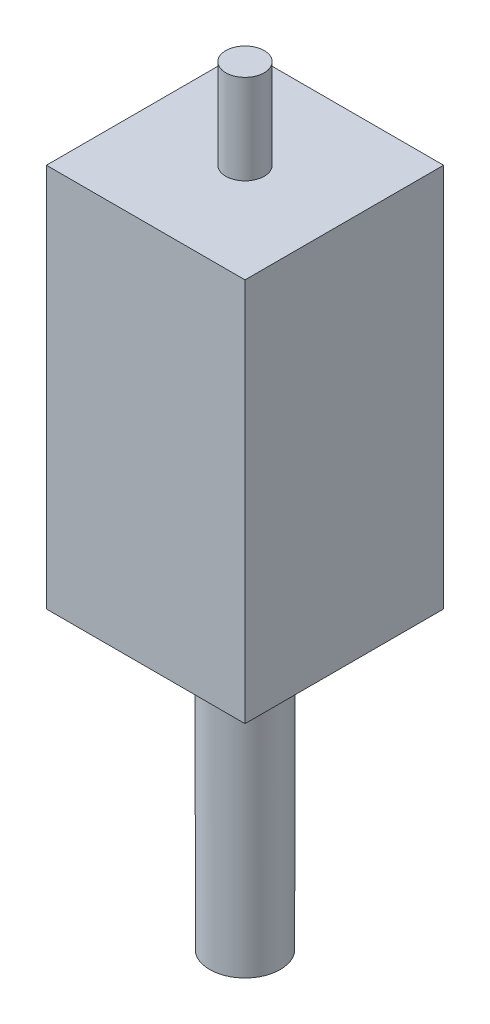
ISO-10303-21;
HEADER;
FILE_DESCRIPTION(('STEP AP214'),'2;1');
FILE_NAME('part.step','',(''),(''),'','','');
FILE_SCHEMA(('AUTOMOTIVE_DESIGN { 1 0 10303 214 1 1 1 1 }'));
ENDSEC;
DATA;
#1=APPLICATION_CONTEXT('core data for automotive mechanical design processes');
#2=APPLICATION_PROTOCOL_DEFINITION('international standard','automotive_design',2000,#1);
#3=PRODUCT_CONTEXT('',#1,'mechanical');
#4=PRODUCT('Part','Part','',(#3));
#5=PRODUCT_RELATED_PRODUCT_CATEGORY('part','',(#4));
#6=PRODUCT_DEFINITION_FORMATION('','',#4);
#7=PRODUCT_DEFINITION_CONTEXT('part definition',#1,'design');
#8=PRODUCT_DEFINITION('design','',#6,#7);
#9=PRODUCT_DEFINITION_SHAPE('','',#8);
#10=(LENGTH_UNIT() NAMED_UNIT(*) SI_UNIT(.MILLI.,.METRE.));
#11=(NAMED_UNIT(*) PLANE_ANGLE_UNIT() SI_UNIT($,.RADIAN.));
#12=(NAMED_UNIT(*) SI_UNIT($,.STERADIAN.) SOLID_ANGLE_UNIT());
#13=UNCERTAINTY_MEASURE_WITH_UNIT(LENGTH_MEASURE(1.E-05),#10,'distance_accuracy_value','');
#14=(GEOMETRIC_REPRESENTATION_CONTEXT(3) GLOBAL_UNCERTAINTY_ASSIGNED_CONTEXT((#13)) GLOBAL_UNIT_ASSIGNED_CONTEXT((#10,
#11,#12)) REPRESENTATION_CONTEXT('',''));
#15=CARTESIAN_POINT('',(0.,0.,0.));
#16=DIRECTION('',(0.,0.,1.));
#17=DIRECTION('',(1.,0.,0.));
#18=AXIS2_PLACEMENT_3D('',#15,#16,#17);
#19=CARTESIAN_POINT('',(-0.879709692178446,15.8049516041819,15.5));
#20=DIRECTION('',(1.,0.,0.));
#21=DIRECTION('',(0.,1.,0.));
#22=AXIS2_PLACEMENT_3D('',#19,#20,#21);
#23=PLANE('',#22);
#24=CARTESIAN_POINT('',(-0.879709692178446,8.30495160418194,7.75));
#25=DIRECTION('',(-1.,0.,0.));
#26=DIRECTION('',(0.,0.,1.));
#27=AXIS2_PLACEMENT_3D('',#24,#25,#26);
#28=CIRCLE('',#27,1.24999999999999);
#29=CARTESIAN_POINT('',(-0.879709692178446,8.30495160418194,8.99999999999999));
#30=VERTEX_POINT('',#29);
#31=EDGE_CURVE('E98',#30,#30,#28,.T.);
#32=ORIENTED_EDGE('',*,*,#31,.F.);
#33=EDGE_LOOP('',(#32));
#34=FACE_BOUND('',#33,.T.);
#35=CARTESIAN_POINT('',(-0.879709692178445,-6.69504839581806,7.75));
#36=DIRECTION('',(-1.,0.,0.));
#37=DIRECTION('',(0.,0.,1.));
#38=AXIS2_PLACEMENT_3D('',#35,#36,#37);
#39=CIRCLE('',#38,1.24999999999999);
#40=CARTESIAN_POINT('',(-0.879709692178445,-6.69504839581806,8.99999999999999));
#41=VERTEX_POINT('',#40);
#42=EDGE_CURVE('E97',#41,#41,#39,.T.);
#43=ORIENTED_EDGE('',*,*,#42,.F.);
#44=EDGE_LOOP('',(#43));
#45=FACE_BOUND('',#44,.T.);
#46=DIRECTION('',(0.,-1.,0.));
#47=VECTOR('',#46,1.);
#48=CARTESIAN_POINT('',(-0.879709692178446,15.8049516041819,0.));
#49=LINE('',#48,#47);
#50=CARTESIAN_POINT('',(-0.879709692178446,15.8049516041819,0.));
#51=VERTEX_POINT('',#50);
#52=CARTESIAN_POINT('',(-0.879709692178442,-14.1950483958181,0.));
#53=VERTEX_POINT('',#52);
#54=EDGE_CURVE('E114',#51,#53,#49,.T.);
#55=ORIENTED_EDGE('',*,*,#54,.T.);
#56=DIRECTION('',(0.,0.,-1.));
#57=VECTOR('',#56,1.);
#58=CARTESIAN_POINT('',(-0.879709692178442,-14.1950483958181,15.5));
#59=LINE('',#58,#57);
#60=CARTESIAN_POINT('',(-0.879709692178442,-14.1950483958181,15.5));
#61=VERTEX_POINT('',#60);
#62=EDGE_CURVE('E133',#61,#53,#59,.T.);
#63=ORIENTED_EDGE('',*,*,#62,.F.);
#64=DIRECTION('',(0.,-1.,0.));
#65=VECTOR('',#64,1.);
#66=CARTESIAN_POINT('',(-0.879709692178446,15.8049516041819,15.5));
#67=LINE('',#66,#65);
#68=CARTESIAN_POINT('',(-0.879709692178446,15.8049516041819,15.5));
#69=VERTEX_POINT('',#68);
#70=EDGE_CURVE('E115',#69,#61,#67,.T.);
#71=ORIENTED_EDGE('',*,*,#70,.F.);
#72=DIRECTION('',(0.,0.,-1.));
#73=VECTOR('',#72,1.);
#74=CARTESIAN_POINT('',(-0.879709692178446,15.8049516041819,15.5));
#75=LINE('',#74,#73);
#76=EDGE_CURVE('E121',#69,#51,#75,.T.);
#77=ORIENTED_EDGE('',*,*,#76,.T.);
#78=EDGE_LOOP('',(#55,#63,#71,#77));
#79=FACE_BOUND('',#78,.T.);
#80=ADVANCED_FACE('F32',(#34,#45,#79),#23,.F.);
#81=CARTESIAN_POINT('',(-0.879709692178442,-14.1950483958181,15.5));
#82=DIRECTION('',(0.,1.,0.));
#83=DIRECTION('',(-1.,0.,0.));
#84=AXIS2_PLACEMENT_3D('',#81,#82,#83);
#85=PLANE('',#84);
#86=CARTESIAN_POINT('',(6.87029030782155,-14.1950483958181,7.75));
#87=DIRECTION('',(0.,1.,0.));
#88=DIRECTION('',(-1.,0.,0.));
#89=AXIS2_PLACEMENT_3D('',#86,#87,#88);
#90=CIRCLE('',#89,2.75);
#91=CARTESIAN_POINT('',(4.12029030782155,-14.1950483958181,7.75));
#92=VERTEX_POINT('',#91);
#93=EDGE_CURVE('E11',#92,#92,#90,.F.);
#94=ORIENTED_EDGE('',*,*,#93,.F.);
#95=EDGE_LOOP('',(#94));
#96=FACE_BOUND('',#95,.T.);
#97=DIRECTION('',(1.,0.,0.));
#98=VECTOR('',#97,1.);
#99=CARTESIAN_POINT('',(-0.879709692178442,-14.1950483958181,0.));
#100=LINE('',#99,#98);
#101=CARTESIAN_POINT('',(14.6202903078216,-14.1950483958181,0.));
#102=VERTEX_POINT('',#101);
#103=EDGE_CURVE('E124',#53,#102,#100,.T.);
#104=ORIENTED_EDGE('',*,*,#103,.T.);
#105=DIRECTION('',(0.,0.,-1.));
#106=VECTOR('',#105,1.);
#107=CARTESIAN_POINT('',(14.6202903078216,-14.1950483958181,15.5));
#108=LINE('',#107,#106);
#109=CARTESIAN_POINT('',(14.6202903078216,-14.1950483958181,15.5));
#110=VERTEX_POINT('',#109);
#111=EDGE_CURVE('E131',#110,#102,#108,.T.);
#112=ORIENTED_EDGE('',*,*,#111,.F.);
#113=DIRECTION('',(1.,0.,0.));
#114=VECTOR('',#113,1.);
#115=CARTESIAN_POINT('',(-0.879709692178442,-14.1950483958181,15.5));
#116=LINE('',#115,#114);
#117=EDGE_CURVE('E80',#61,#110,#116,.T.);
#118=ORIENTED_EDGE('',*,*,#117,.F.);
#119=ORIENTED_EDGE('',*,*,#62,.T.);
#120=EDGE_LOOP('',(#104,#112,#118,#119));
#121=FACE_BOUND('',#120,.T.);
#122=ADVANCED_FACE('F150',(#96,#121),#85,.F.);
#123=CARTESIAN_POINT('',(14.6202903078216,15.8049516041819,15.5));
#124=DIRECTION('',(-1.,0.,0.));
#125=DIRECTION('',(0.,0.,1.));
#126=AXIS2_PLACEMENT_3D('',#123,#124,#125);
#127=PLANE('',#126);
#128=DIRECTION('',(0.,1.,0.));
#129=VECTOR('',#128,1.);
#130=CARTESIAN_POINT('',(14.6202903078216,15.8049516041819,0.));
#131=LINE('',#130,#129);
#132=CARTESIAN_POINT('',(14.6202903078216,15.8049516041819,0.));
#133=VERTEX_POINT('',#132);
#134=EDGE_CURVE('E66',#102,#133,#131,.T.);
#135=ORIENTED_EDGE('',*,*,#134,.T.);
#136=DIRECTION('',(0.,0.,-1.));
#137=VECTOR('',#136,1.);
#138=CARTESIAN_POINT('',(14.6202903078216,15.8049516041819,15.5));
#139=LINE('',#138,#137);
#140=CARTESIAN_POINT('',(14.6202903078216,15.8049516041819,15.5));
#141=VERTEX_POINT('',#140);
#142=EDGE_CURVE('E129',#141,#133,#139,.T.);
#143=ORIENTED_EDGE('',*,*,#142,.F.);
#144=DIRECTION('',(0.,1.,0.));
#145=VECTOR('',#144,1.);
#146=CARTESIAN_POINT('',(14.6202903078216,15.8049516041819,15.5));
#147=LINE('',#146,#145);
#148=EDGE_CURVE('E118',#110,#141,#147,.T.);
#149=ORIENTED_EDGE('',*,*,#148,.F.);
#150=ORIENTED_EDGE('',*,*,#111,.T.);
#151=EDGE_LOOP('',(#135,#143,#149,#150));
#152=FACE_BOUND('',#151,.T.);
#153=ADVANCED_FACE('F142',(#152),#127,.F.);
#154=CARTESIAN_POINT('',(-0.879709692178446,15.8049516041819,15.5));
#155=DIRECTION('',(0.,-1.,0.));
#156=DIRECTION('',(0.,0.,-1.));
#157=AXIS2_PLACEMENT_3D('',#154,#155,#156);
#158=PLANE('',#157);
#159=CARTESIAN_POINT('',(6.87029030782155,15.8049516041819,7.75));
#160=DIRECTION('',(0.,-1.,0.));
#161=DIRECTION('',(0.,0.,-1.));
#162=AXIS2_PLACEMENT_3D('',#159,#160,#161);
#163=CIRCLE('',#162,1.5);
#164=CARTESIAN_POINT('',(6.87029030782155,15.8049516041819,6.25));
#165=VERTEX_POINT('',#164);
#166=EDGE_CURVE('E40',#165,#165,#163,.F.);
#167=ORIENTED_EDGE('',*,*,#166,.F.);
#168=EDGE_LOOP('',(#167));
#169=FACE_BOUND('',#168,.T.);
#170=DIRECTION('',(-1.,0.,0.));
#171=VECTOR('',#170,1.);
#172=CARTESIAN_POINT('',(-0.879709692178446,15.8049516041819,0.));
#173=LINE('',#172,#171);
#174=EDGE_CURVE('E72',#133,#51,#173,.T.);
#175=ORIENTED_EDGE('',*,*,#174,.T.);
#176=ORIENTED_EDGE('',*,*,#76,.F.);
#177=DIRECTION('',(-1.,0.,0.));
#178=VECTOR('',#177,1.);
#179=CARTESIAN_POINT('',(-0.879709692178446,15.8049516041819,15.5));
#180=LINE('',#179,#178);
#181=EDGE_CURVE('E48',#141,#69,#180,.T.);
#182=ORIENTED_EDGE('',*,*,#181,.F.);
#183=ORIENTED_EDGE('',*,*,#142,.T.);
#184=EDGE_LOOP('',(#175,#176,#182,#183));
#185=FACE_BOUND('',#184,.T.);
#186=ADVANCED_FACE('F139',(#169,#185),#158,.F.);
#187=CARTESIAN_POINT('',(0.,0.,15.5));
#188=DIRECTION('',(0.,0.,1.));
#189=DIRECTION('',(1.,0.,0.));
#190=AXIS2_PLACEMENT_3D('',#187,#188,#189);
#191=PLANE('',#190);
#192=ORIENTED_EDGE('',*,*,#70,.T.);
#193=ORIENTED_EDGE('',*,*,#117,.T.);
#194=ORIENTED_EDGE('',*,*,#148,.T.);
#195=ORIENTED_EDGE('',*,*,#181,.T.);
#196=EDGE_LOOP('',(#192,#193,#194,#195));
#197=FACE_BOUND('',#196,.T.);
#198=ADVANCED_FACE('F141',(#197),#191,.T.);
#199=CARTESIAN_POINT('',(0.,0.,0.));
#200=DIRECTION('',(0.,0.,1.));
#201=DIRECTION('',(1.,0.,0.));
#202=AXIS2_PLACEMENT_3D('',#199,#200,#201);
#203=PLANE('',#202);
#204=ORIENTED_EDGE('',*,*,#54,.F.);
#205=ORIENTED_EDGE('',*,*,#174,.F.);
#206=ORIENTED_EDGE('',*,*,#134,.F.);
#207=ORIENTED_EDGE('',*,*,#103,.F.);
#208=EDGE_LOOP('',(#204,#205,#206,#207));
#209=FACE_BOUND('',#208,.T.);
#210=ADVANCED_FACE('F148',(#209),#203,.F.);
#211=CARTESIAN_POINT('',(6.87029030782155,22.8049516041819,7.75));
#212=DIRECTION('',(0.,-1.,0.));
#213=DIRECTION('',(0.,0.,-1.));
#214=AXIS2_PLACEMENT_3D('',#211,#212,#213);
#215=CYLINDRICAL_SURFACE('',#214,1.5);
#216=CARTESIAN_POINT('',(6.87029030782155,22.8049516041819,7.75));
#217=DIRECTION('',(0.,1.,0.));
#218=DIRECTION('',(0.,0.,1.));
#219=AXIS2_PLACEMENT_3D('',#216,#217,#218);
#220=CIRCLE('',#219,1.5);
#221=CARTESIAN_POINT('',(6.87029030782155,22.8049516041819,9.25));
#222=VERTEX_POINT('',#221);
#223=EDGE_CURVE('E111',#222,#222,#220,.T.);
#224=ORIENTED_EDGE('',*,*,#223,.F.);
#225=EDGE_LOOP('',(#224));
#226=FACE_BOUND('',#225,.T.);
#227=ORIENTED_EDGE('',*,*,#166,.T.);
#228=EDGE_LOOP('',(#227));
#229=FACE_BOUND('',#228,.T.);
#230=ADVANCED_FACE('F137',(#226,#229),#215,.T.);
#231=CARTESIAN_POINT('',(6.87029030782155,22.8049516041819,7.75));
#232=DIRECTION('',(0.,1.,0.));
#233=DIRECTION('',(0.,0.,1.));
#234=AXIS2_PLACEMENT_3D('',#231,#232,#233);
#235=PLANE('',#234);
#236=ORIENTED_EDGE('',*,*,#223,.T.);
#237=EDGE_LOOP('',(#236));
#238=FACE_BOUND('',#237,.T.);
#239=ADVANCED_FACE('F172',(#238),#235,.T.);
#240=CARTESIAN_POINT('',(6.87029030782156,-37.1950483958181,7.75));
#241=DIRECTION('',(0.,1.,0.));
#242=DIRECTION('',(-1.,0.,0.));
#243=AXIS2_PLACEMENT_3D('',#240,#241,#242);
#244=CYLINDRICAL_SURFACE('',#243,2.75);
#245=CARTESIAN_POINT('',(6.87029030782156,-37.1950483958181,7.75));
#246=DIRECTION('',(0.,-1.,0.));
#247=DIRECTION('',(1.,0.,0.));
#248=AXIS2_PLACEMENT_3D('',#245,#246,#247);
#249=CIRCLE('',#248,2.75);
#250=CARTESIAN_POINT('',(9.62029030782156,-37.1950483958181,7.75));
#251=VERTEX_POINT('',#250);
#252=EDGE_CURVE('E108',#251,#251,#249,.T.);
#253=ORIENTED_EDGE('',*,*,#252,.F.);
#254=EDGE_LOOP('',(#253));
#255=FACE_BOUND('',#254,.T.);
#256=ORIENTED_EDGE('',*,*,#93,.T.);
#257=EDGE_LOOP('',(#256));
#258=FACE_BOUND('',#257,.T.);
#259=ADVANCED_FACE('F178',(#255,#258),#244,.T.);
#260=CARTESIAN_POINT('',(6.87029030782156,-37.1950483958181,7.75));
#261=DIRECTION('',(0.,-1.,0.));
#262=DIRECTION('',(1.,0.,0.));
#263=AXIS2_PLACEMENT_3D('',#260,#261,#262);
#264=PLANE('',#263);
#265=ORIENTED_EDGE('',*,*,#252,.T.);
#266=EDGE_LOOP('',(#265));
#267=FACE_BOUND('',#266,.T.);
#268=ADVANCED_FACE('F182',(#267),#264,.T.);
#269=CARTESIAN_POINT('',(0.220290307821557,-6.69504839581806,7.75));
#270=DIRECTION('',(-1.,0.,0.));
#271=DIRECTION('',(0.,0.,1.));
#272=AXIS2_PLACEMENT_3D('',#269,#270,#271);
#273=CONICAL_SURFACE('',#272,1.25,1.02974425867665);
#274=CARTESIAN_POINT('',(0.971366081606008,-6.69504839581806,7.75));
#275=VERTEX_POINT('',#274);
#276=VERTEX_LOOP('',#275);
#277=FACE_BOUND('',#276,.T.);
#278=CARTESIAN_POINT('',(0.220290307821557,-6.69504839581806,7.75));
#279=DIRECTION('',(-1.,0.,0.));
#280=DIRECTION('',(0.,0.,1.));
#281=AXIS2_PLACEMENT_3D('',#278,#279,#280);
#282=CIRCLE('',#281,1.25);
#283=CARTESIAN_POINT('',(0.220290307821557,-6.69504839581806,9.));
#284=VERTEX_POINT('',#283);
#285=EDGE_CURVE('E101',#284,#284,#282,.T.);
#286=ORIENTED_EDGE('',*,*,#285,.T.);
#287=EDGE_LOOP('',(#286));
#288=FACE_BOUND('',#287,.T.);
#289=ADVANCED_FACE('F186',(#277,#288),#273,.F.);
#290=CARTESIAN_POINT('',(-0.879709692178443,-6.69504839581806,7.75));
#291=DIRECTION('',(-1.,0.,0.));
#292=DIRECTION('',(0.,0.,1.));
#293=AXIS2_PLACEMENT_3D('',#290,#291,#292);
#294=CYLINDRICAL_SURFACE('',#293,1.24999999999999);
#295=ORIENTED_EDGE('',*,*,#285,.F.);
#296=EDGE_LOOP('',(#295));
#297=FACE_BOUND('',#296,.T.);
#298=ORIENTED_EDGE('',*,*,#42,.T.);
#299=EDGE_LOOP('',(#298));
#300=FACE_BOUND('',#299,.T.);
#301=ADVANCED_FACE('F91',(#297,#300),#294,.F.);
#302=CARTESIAN_POINT('',(0.220290307821555,8.30495160418194,7.75));
#303=DIRECTION('',(-1.,0.,0.));
#304=DIRECTION('',(0.,0.,1.));
#305=AXIS2_PLACEMENT_3D('',#302,#303,#304);
#306=CONICAL_SURFACE('',#305,1.25,1.02974425867665);
#307=CARTESIAN_POINT('',(0.971366081606006,8.30495160418194,7.75));
#308=VERTEX_POINT('',#307);
#309=VERTEX_LOOP('',#308);
#310=FACE_BOUND('',#309,.T.);
#311=CARTESIAN_POINT('',(0.220290307821555,8.30495160418194,7.75));
#312=DIRECTION('',(-1.,0.,0.));
#313=DIRECTION('',(0.,0.,1.));
#314=AXIS2_PLACEMENT_3D('',#311,#312,#313);
#315=CIRCLE('',#314,1.25);
#316=CARTESIAN_POINT('',(0.220290307821555,8.30495160418194,9.));
#317=VERTEX_POINT('',#316);
#318=EDGE_CURVE('E95',#317,#317,#315,.T.);
#319=ORIENTED_EDGE('',*,*,#318,.T.);
#320=EDGE_LOOP('',(#319));
#321=FACE_BOUND('',#320,.T.);
#322=ADVANCED_FACE('F87',(#310,#321),#306,.F.);
#323=CARTESIAN_POINT('',(-0.879709692178445,8.30495160418194,7.75));
#324=DIRECTION('',(-1.,0.,0.));
#325=DIRECTION('',(0.,0.,1.));
#326=AXIS2_PLACEMENT_3D('',#323,#324,#325);
#327=CYLINDRICAL_SURFACE('',#326,1.24999999999999);
#328=ORIENTED_EDGE('',*,*,#318,.F.);
#329=EDGE_LOOP('',(#328));
#330=FACE_BOUND('',#329,.T.);
#331=ORIENTED_EDGE('',*,*,#31,.T.);
#332=EDGE_LOOP('',(#331));
#333=FACE_BOUND('',#332,.T.);
#334=ADVANCED_FACE('F90',(#330,#333),#327,.F.);
#335=CLOSED_SHELL('',(#80,#122,#153,#186,#198,#210,#230,#239,#259,#268,#289,#301,#322,#334));
#336=MANIFOLD_SOLID_BREP('B2',#335);
#337=ADVANCED_BREP_SHAPE_REPRESENTATION('',(#18,#336),#14);
#338=SHAPE_DEFINITION_REPRESENTATION(#9,#337);
ENDSEC;
END-ISO-10303-21;
